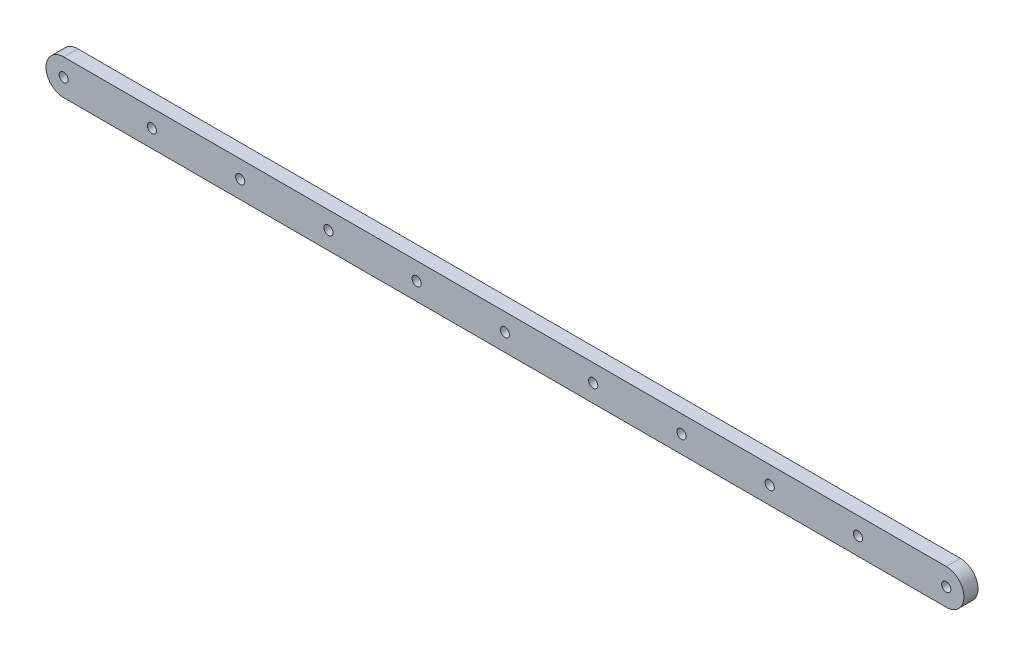
ISO-10303-21;
HEADER;
FILE_DESCRIPTION(('STEP AP214'),'2;1');
FILE_NAME('part.step','',(''),(''),'','','');
FILE_SCHEMA(('AUTOMOTIVE_DESIGN { 1 0 10303 214 1 1 1 1 }'));
ENDSEC;
DATA;
#1=APPLICATION_CONTEXT('core data for automotive mechanical design processes');
#2=APPLICATION_PROTOCOL_DEFINITION('international standard','automotive_design',2000,#1);
#3=PRODUCT_CONTEXT('',#1,'mechanical');
#4=PRODUCT('Part','Part','',(#3));
#5=PRODUCT_RELATED_PRODUCT_CATEGORY('part','',(#4));
#6=PRODUCT_DEFINITION_FORMATION('','',#4);
#7=PRODUCT_DEFINITION_CONTEXT('part definition',#1,'design');
#8=PRODUCT_DEFINITION('design','',#6,#7);
#9=PRODUCT_DEFINITION_SHAPE('','',#8);
#10=(LENGTH_UNIT() NAMED_UNIT(*) SI_UNIT(.MILLI.,.METRE.));
#11=(NAMED_UNIT(*) PLANE_ANGLE_UNIT() SI_UNIT($,.RADIAN.));
#12=(NAMED_UNIT(*) SI_UNIT($,.STERADIAN.) SOLID_ANGLE_UNIT());
#13=UNCERTAINTY_MEASURE_WITH_UNIT(LENGTH_MEASURE(1.E-05),#10,'distance_accuracy_value','');
#14=(GEOMETRIC_REPRESENTATION_CONTEXT(3) GLOBAL_UNCERTAINTY_ASSIGNED_CONTEXT((#13)) GLOBAL_UNIT_ASSIGNED_CONTEXT((#10,
#11,#12)) REPRESENTATION_CONTEXT('',''));
#15=CARTESIAN_POINT('',(0.,0.,0.));
#16=DIRECTION('',(0.,0.,1.));
#17=DIRECTION('',(1.,0.,0.));
#18=AXIS2_PLACEMENT_3D('',#15,#16,#17);
#19=CARTESIAN_POINT('',(0.,-5.,4.));
#20=DIRECTION('',(0.,-1.,0.));
#21=DIRECTION('',(1.,0.,0.));
#22=AXIS2_PLACEMENT_3D('',#19,#20,#21);
#23=PLANE('',#22);
#24=DIRECTION('',(-1.,0.,0.));
#25=VECTOR('',#24,1.);
#26=CARTESIAN_POINT('',(0.,-5.,0.));
#27=LINE('',#26,#25);
#28=CARTESIAN_POINT('',(250.,-5.,0.));
#29=VERTEX_POINT('',#28);
#30=CARTESIAN_POINT('',(0.,-5.,0.));
#31=VERTEX_POINT('',#30);
#32=EDGE_CURVE('E111',#29,#31,#27,.T.);
#33=ORIENTED_EDGE('',*,*,#32,.F.);
#34=DIRECTION('',(0.,0.,-1.));
#35=VECTOR('',#34,1.);
#36=CARTESIAN_POINT('',(250.,-5.,4.));
#37=LINE('',#36,#35);
#38=CARTESIAN_POINT('',(250.,-5.,4.));
#39=VERTEX_POINT('',#38);
#40=EDGE_CURVE('E11',#39,#29,#37,.T.);
#41=ORIENTED_EDGE('',*,*,#40,.F.);
#42=DIRECTION('',(-1.,0.,0.));
#43=VECTOR('',#42,1.);
#44=CARTESIAN_POINT('',(0.,-5.,4.));
#45=LINE('',#44,#43);
#46=CARTESIAN_POINT('',(0.,-5.,4.));
#47=VERTEX_POINT('',#46);
#48=EDGE_CURVE('E92',#39,#47,#45,.T.);
#49=ORIENTED_EDGE('',*,*,#48,.T.);
#50=DIRECTION('',(0.,0.,-1.));
#51=VECTOR('',#50,1.);
#52=CARTESIAN_POINT('',(0.,-5.,4.));
#53=LINE('',#52,#51);
#54=EDGE_CURVE('E82',#47,#31,#53,.T.);
#55=ORIENTED_EDGE('',*,*,#54,.T.);
#56=EDGE_LOOP('',(#33,#41,#49,#55));
#57=FACE_BOUND('',#56,.T.);
#58=ADVANCED_FACE('F43',(#57),#23,.T.);
#59=CARTESIAN_POINT('',(250.,0.,4.));
#60=DIRECTION('',(0.,0.,-1.));
#61=DIRECTION('',(-1.,0.,0.));
#62=AXIS2_PLACEMENT_3D('',#59,#60,#61);
#63=CYLINDRICAL_SURFACE('',#62,4.99999999999999);
#64=CARTESIAN_POINT('',(250.,0.,0.));
#65=DIRECTION('',(0.,0.,1.));
#66=DIRECTION('',(1.,0.,0.));
#67=AXIS2_PLACEMENT_3D('',#64,#65,#66);
#68=CIRCLE('',#67,4.99999999999999);
#69=CARTESIAN_POINT('',(250.,5.,0.));
#70=VERTEX_POINT('',#69);
#71=EDGE_CURVE('E99',#29,#70,#68,.T.);
#72=ORIENTED_EDGE('',*,*,#71,.T.);
#73=DIRECTION('',(0.,0.,-1.));
#74=VECTOR('',#73,1.);
#75=CARTESIAN_POINT('',(250.,5.,4.));
#76=LINE('',#75,#74);
#77=CARTESIAN_POINT('',(250.,5.,4.));
#78=VERTEX_POINT('',#77);
#79=EDGE_CURVE('E52',#78,#70,#76,.T.);
#80=ORIENTED_EDGE('',*,*,#79,.F.);
#81=CARTESIAN_POINT('',(250.,0.,4.));
#82=DIRECTION('',(0.,0.,1.));
#83=DIRECTION('',(1.,0.,0.));
#84=AXIS2_PLACEMENT_3D('',#81,#82,#83);
#85=CIRCLE('',#84,4.99999999999999);
#86=EDGE_CURVE('E87',#39,#78,#85,.T.);
#87=ORIENTED_EDGE('',*,*,#86,.F.);
#88=ORIENTED_EDGE('',*,*,#40,.T.);
#89=EDGE_LOOP('',(#72,#80,#87,#88));
#90=FACE_BOUND('',#89,.T.);
#91=ADVANCED_FACE('F97',(#90),#63,.T.);
#92=CARTESIAN_POINT('',(0.,5.,4.));
#93=DIRECTION('',(0.,1.,0.));
#94=DIRECTION('',(-1.,0.,0.));
#95=AXIS2_PLACEMENT_3D('',#92,#93,#94);
#96=PLANE('',#95);
#97=DIRECTION('',(1.,0.,0.));
#98=VECTOR('',#97,1.);
#99=CARTESIAN_POINT('',(0.,5.,0.));
#100=LINE('',#99,#98);
#101=CARTESIAN_POINT('',(0.,5.,0.));
#102=VERTEX_POINT('',#101);
#103=EDGE_CURVE('E118',#102,#70,#100,.T.);
#104=ORIENTED_EDGE('',*,*,#103,.F.);
#105=DIRECTION('',(0.,0.,-1.));
#106=VECTOR('',#105,1.);
#107=CARTESIAN_POINT('',(0.,5.,4.));
#108=LINE('',#107,#106);
#109=CARTESIAN_POINT('',(0.,5.,4.));
#110=VERTEX_POINT('',#109);
#111=EDGE_CURVE('E75',#110,#102,#108,.T.);
#112=ORIENTED_EDGE('',*,*,#111,.F.);
#113=DIRECTION('',(1.,0.,0.));
#114=VECTOR('',#113,1.);
#115=CARTESIAN_POINT('',(0.,5.,4.));
#116=LINE('',#115,#114);
#117=EDGE_CURVE('E91',#110,#78,#116,.T.);
#118=ORIENTED_EDGE('',*,*,#117,.T.);
#119=ORIENTED_EDGE('',*,*,#79,.T.);
#120=EDGE_LOOP('',(#104,#112,#118,#119));
#121=FACE_BOUND('',#120,.T.);
#122=ADVANCED_FACE('F104',(#121),#96,.T.);
#123=CARTESIAN_POINT('',(0.,0.,4.));
#124=DIRECTION('',(0.,0.,-1.));
#125=DIRECTION('',(-1.,0.,0.));
#126=AXIS2_PLACEMENT_3D('',#123,#124,#125);
#127=CYLINDRICAL_SURFACE('',#126,5.);
#128=CARTESIAN_POINT('',(0.,0.,0.));
#129=DIRECTION('',(0.,0.,1.));
#130=DIRECTION('',(1.,0.,0.));
#131=AXIS2_PLACEMENT_3D('',#128,#129,#130);
#132=CIRCLE('',#131,5.);
#133=EDGE_CURVE('E121',#102,#31,#132,.T.);
#134=ORIENTED_EDGE('',*,*,#133,.T.);
#135=ORIENTED_EDGE('',*,*,#54,.F.);
#136=CARTESIAN_POINT('',(0.,0.,4.));
#137=DIRECTION('',(0.,0.,1.));
#138=DIRECTION('',(1.,0.,0.));
#139=AXIS2_PLACEMENT_3D('',#136,#137,#138);
#140=CIRCLE('',#139,5.);
#141=EDGE_CURVE('E60',#110,#47,#140,.T.);
#142=ORIENTED_EDGE('',*,*,#141,.F.);
#143=ORIENTED_EDGE('',*,*,#111,.T.);
#144=EDGE_LOOP('',(#134,#135,#142,#143));
#145=FACE_BOUND('',#144,.T.);
#146=ADVANCED_FACE('F229',(#145),#127,.T.);
#147=CARTESIAN_POINT('',(0.,0.,4.));
#148=DIRECTION('',(0.,0.,1.));
#149=DIRECTION('',(1.,0.,0.));
#150=AXIS2_PLACEMENT_3D('',#147,#148,#149);
#151=PLANE('',#150);
#152=CARTESIAN_POINT('',(25.,0.,4.));
#153=DIRECTION('',(0.,0.,1.));
#154=DIRECTION('',(1.,0.,0.));
#155=AXIS2_PLACEMENT_3D('',#152,#153,#154);
#156=CIRCLE('',#155,1.3);
#157=CARTESIAN_POINT('',(26.3,0.,4.));
#158=VERTEX_POINT('',#157);
#159=EDGE_CURVE('E154',#158,#158,#156,.T.);
#160=ORIENTED_EDGE('',*,*,#159,.F.);
#161=EDGE_LOOP('',(#160));
#162=FACE_BOUND('',#161,.T.);
#163=CARTESIAN_POINT('',(175.,0.,4.));
#164=DIRECTION('',(0.,0.,1.));
#165=DIRECTION('',(1.,0.,0.));
#166=AXIS2_PLACEMENT_3D('',#163,#164,#165);
#167=CIRCLE('',#166,1.3);
#168=CARTESIAN_POINT('',(176.3,0.,4.));
#169=VERTEX_POINT('',#168);
#170=EDGE_CURVE('E187',#169,#169,#167,.T.);
#171=ORIENTED_EDGE('',*,*,#170,.F.);
#172=EDGE_LOOP('',(#171));
#173=FACE_BOUND('',#172,.T.);
#174=CARTESIAN_POINT('',(150.,0.,4.));
#175=DIRECTION('',(0.,0.,1.));
#176=DIRECTION('',(1.,0.,0.));
#177=AXIS2_PLACEMENT_3D('',#174,#175,#176);
#178=CIRCLE('',#177,1.3);
#179=CARTESIAN_POINT('',(151.3,0.,4.));
#180=VERTEX_POINT('',#179);
#181=EDGE_CURVE('E179',#180,#180,#178,.T.);
#182=ORIENTED_EDGE('',*,*,#181,.F.);
#183=EDGE_LOOP('',(#182));
#184=FACE_BOUND('',#183,.T.);
#185=CARTESIAN_POINT('',(225.,0.,4.));
#186=DIRECTION('',(0.,0.,1.));
#187=DIRECTION('',(1.,0.,0.));
#188=AXIS2_PLACEMENT_3D('',#185,#186,#187);
#189=CIRCLE('',#188,1.3);
#190=CARTESIAN_POINT('',(226.3,0.,4.));
#191=VERTEX_POINT('',#190);
#192=EDGE_CURVE('E203',#191,#191,#189,.T.);
#193=ORIENTED_EDGE('',*,*,#192,.F.);
#194=EDGE_LOOP('',(#193));
#195=FACE_BOUND('',#194,.T.);
#196=CARTESIAN_POINT('',(200.,0.,4.));
#197=DIRECTION('',(0.,0.,1.));
#198=DIRECTION('',(1.,0.,0.));
#199=AXIS2_PLACEMENT_3D('',#196,#197,#198);
#200=CIRCLE('',#199,1.3);
#201=CARTESIAN_POINT('',(201.3,0.,4.));
#202=VERTEX_POINT('',#201);
#203=EDGE_CURVE('E195',#202,#202,#200,.T.);
#204=ORIENTED_EDGE('',*,*,#203,.F.);
#205=EDGE_LOOP('',(#204));
#206=FACE_BOUND('',#205,.T.);
#207=CARTESIAN_POINT('',(75.,0.,4.));
#208=DIRECTION('',(0.,0.,1.));
#209=DIRECTION('',(1.,0.,0.));
#210=AXIS2_PLACEMENT_3D('',#207,#208,#209);
#211=CIRCLE('',#210,1.3);
#212=CARTESIAN_POINT('',(76.3,0.,4.));
#213=VERTEX_POINT('',#212);
#214=EDGE_CURVE('E155',#213,#213,#211,.T.);
#215=ORIENTED_EDGE('',*,*,#214,.F.);
#216=EDGE_LOOP('',(#215));
#217=FACE_BOUND('',#216,.T.);
#218=CARTESIAN_POINT('',(50.,0.,4.));
#219=DIRECTION('',(0.,0.,1.));
#220=DIRECTION('',(1.,0.,0.));
#221=AXIS2_PLACEMENT_3D('',#218,#219,#220);
#222=CIRCLE('',#221,1.3);
#223=CARTESIAN_POINT('',(51.3,0.,4.));
#224=VERTEX_POINT('',#223);
#225=EDGE_CURVE('E145',#224,#224,#222,.T.);
#226=ORIENTED_EDGE('',*,*,#225,.F.);
#227=EDGE_LOOP('',(#226));
#228=FACE_BOUND('',#227,.T.);
#229=CARTESIAN_POINT('',(125.,0.,4.));
#230=DIRECTION('',(0.,0.,1.));
#231=DIRECTION('',(1.,0.,0.));
#232=AXIS2_PLACEMENT_3D('',#229,#230,#231);
#233=CIRCLE('',#232,1.3);
#234=CARTESIAN_POINT('',(126.3,0.,4.));
#235=VERTEX_POINT('',#234);
#236=EDGE_CURVE('E171',#235,#235,#233,.T.);
#237=ORIENTED_EDGE('',*,*,#236,.F.);
#238=EDGE_LOOP('',(#237));
#239=FACE_BOUND('',#238,.T.);
#240=CARTESIAN_POINT('',(100.,0.,4.));
#241=DIRECTION('',(0.,0.,1.));
#242=DIRECTION('',(1.,0.,0.));
#243=AXIS2_PLACEMENT_3D('',#240,#241,#242);
#244=CIRCLE('',#243,1.3);
#245=CARTESIAN_POINT('',(101.3,0.,4.));
#246=VERTEX_POINT('',#245);
#247=EDGE_CURVE('E163',#246,#246,#244,.T.);
#248=ORIENTED_EDGE('',*,*,#247,.F.);
#249=EDGE_LOOP('',(#248));
#250=FACE_BOUND('',#249,.T.);
#251=CARTESIAN_POINT('',(0.,0.,4.));
#252=DIRECTION('',(0.,0.,1.));
#253=DIRECTION('',(1.,0.,0.));
#254=AXIS2_PLACEMENT_3D('',#251,#252,#253);
#255=CIRCLE('',#254,1.3);
#256=CARTESIAN_POINT('',(1.3,0.,4.));
#257=VERTEX_POINT('',#256);
#258=EDGE_CURVE('E138',#257,#257,#255,.T.);
#259=ORIENTED_EDGE('',*,*,#258,.F.);
#260=EDGE_LOOP('',(#259));
#261=FACE_BOUND('',#260,.T.);
#262=CARTESIAN_POINT('',(250.,0.,4.));
#263=DIRECTION('',(0.,0.,1.));
#264=DIRECTION('',(1.,0.,0.));
#265=AXIS2_PLACEMENT_3D('',#262,#263,#264);
#266=CIRCLE('',#265,1.30000000000004);
#267=CARTESIAN_POINT('',(251.3,0.,4.));
#268=VERTEX_POINT('',#267);
#269=EDGE_CURVE('E129',#268,#268,#266,.T.);
#270=ORIENTED_EDGE('',*,*,#269,.F.);
#271=EDGE_LOOP('',(#270));
#272=FACE_BOUND('',#271,.T.);
#273=ORIENTED_EDGE('',*,*,#48,.F.);
#274=ORIENTED_EDGE('',*,*,#86,.T.);
#275=ORIENTED_EDGE('',*,*,#117,.F.);
#276=ORIENTED_EDGE('',*,*,#141,.T.);
#277=EDGE_LOOP('',(#273,#274,#275,#276));
#278=FACE_BOUND('',#277,.T.);
#279=ADVANCED_FACE('F89',(#162,#173,#184,#195,#206,#217,#228,#239,#250,#261,#272,#278),#151,.T.);
#280=CARTESIAN_POINT('',(0.,0.,0.));
#281=DIRECTION('',(0.,0.,1.));
#282=DIRECTION('',(1.,0.,0.));
#283=AXIS2_PLACEMENT_3D('',#280,#281,#282);
#284=PLANE('',#283);
#285=CARTESIAN_POINT('',(25.,0.,0.));
#286=DIRECTION('',(0.,0.,1.));
#287=DIRECTION('',(1.,0.,0.));
#288=AXIS2_PLACEMENT_3D('',#285,#286,#287);
#289=CIRCLE('',#288,1.3);
#290=CARTESIAN_POINT('',(26.3,0.,0.));
#291=VERTEX_POINT('',#290);
#292=EDGE_CURVE('E134',#291,#291,#289,.T.);
#293=ORIENTED_EDGE('',*,*,#292,.T.);
#294=EDGE_LOOP('',(#293));
#295=FACE_BOUND('',#294,.T.);
#296=CARTESIAN_POINT('',(175.,0.,0.));
#297=DIRECTION('',(0.,0.,1.));
#298=DIRECTION('',(1.,0.,0.));
#299=AXIS2_PLACEMENT_3D('',#296,#297,#298);
#300=CIRCLE('',#299,1.3);
#301=CARTESIAN_POINT('',(176.3,0.,0.));
#302=VERTEX_POINT('',#301);
#303=EDGE_CURVE('E183',#302,#302,#300,.T.);
#304=ORIENTED_EDGE('',*,*,#303,.T.);
#305=EDGE_LOOP('',(#304));
#306=FACE_BOUND('',#305,.T.);
#307=CARTESIAN_POINT('',(150.,0.,0.));
#308=DIRECTION('',(0.,0.,1.));
#309=DIRECTION('',(1.,0.,0.));
#310=AXIS2_PLACEMENT_3D('',#307,#308,#309);
#311=CIRCLE('',#310,1.3);
#312=CARTESIAN_POINT('',(151.3,0.,0.));
#313=VERTEX_POINT('',#312);
#314=EDGE_CURVE('E175',#313,#313,#311,.T.);
#315=ORIENTED_EDGE('',*,*,#314,.T.);
#316=EDGE_LOOP('',(#315));
#317=FACE_BOUND('',#316,.T.);
#318=CARTESIAN_POINT('',(225.,0.,0.));
#319=DIRECTION('',(0.,0.,1.));
#320=DIRECTION('',(1.,0.,0.));
#321=AXIS2_PLACEMENT_3D('',#318,#319,#320);
#322=CIRCLE('',#321,1.3);
#323=CARTESIAN_POINT('',(226.3,0.,0.));
#324=VERTEX_POINT('',#323);
#325=EDGE_CURVE('E199',#324,#324,#322,.T.);
#326=ORIENTED_EDGE('',*,*,#325,.T.);
#327=EDGE_LOOP('',(#326));
#328=FACE_BOUND('',#327,.T.);
#329=CARTESIAN_POINT('',(200.,0.,0.));
#330=DIRECTION('',(0.,0.,1.));
#331=DIRECTION('',(1.,0.,0.));
#332=AXIS2_PLACEMENT_3D('',#329,#330,#331);
#333=CIRCLE('',#332,1.3);
#334=CARTESIAN_POINT('',(201.3,0.,0.));
#335=VERTEX_POINT('',#334);
#336=EDGE_CURVE('E191',#335,#335,#333,.T.);
#337=ORIENTED_EDGE('',*,*,#336,.T.);
#338=EDGE_LOOP('',(#337));
#339=FACE_BOUND('',#338,.T.);
#340=CARTESIAN_POINT('',(75.,0.,0.));
#341=DIRECTION('',(0.,0.,1.));
#342=DIRECTION('',(1.,0.,0.));
#343=AXIS2_PLACEMENT_3D('',#340,#341,#342);
#344=CIRCLE('',#343,1.3);
#345=CARTESIAN_POINT('',(76.3,0.,0.));
#346=VERTEX_POINT('',#345);
#347=EDGE_CURVE('E150',#346,#346,#344,.T.);
#348=ORIENTED_EDGE('',*,*,#347,.T.);
#349=EDGE_LOOP('',(#348));
#350=FACE_BOUND('',#349,.T.);
#351=CARTESIAN_POINT('',(50.,0.,0.));
#352=DIRECTION('',(0.,0.,1.));
#353=DIRECTION('',(1.,0.,0.));
#354=AXIS2_PLACEMENT_3D('',#351,#352,#353);
#355=CIRCLE('',#354,1.3);
#356=CARTESIAN_POINT('',(51.3,0.,0.));
#357=VERTEX_POINT('',#356);
#358=EDGE_CURVE('E149',#357,#357,#355,.T.);
#359=ORIENTED_EDGE('',*,*,#358,.T.);
#360=EDGE_LOOP('',(#359));
#361=FACE_BOUND('',#360,.T.);
#362=CARTESIAN_POINT('',(125.,0.,0.));
#363=DIRECTION('',(0.,0.,1.));
#364=DIRECTION('',(1.,0.,0.));
#365=AXIS2_PLACEMENT_3D('',#362,#363,#364);
#366=CIRCLE('',#365,1.3);
#367=CARTESIAN_POINT('',(126.3,0.,0.));
#368=VERTEX_POINT('',#367);
#369=EDGE_CURVE('E167',#368,#368,#366,.T.);
#370=ORIENTED_EDGE('',*,*,#369,.T.);
#371=EDGE_LOOP('',(#370));
#372=FACE_BOUND('',#371,.T.);
#373=CARTESIAN_POINT('',(100.,0.,0.));
#374=DIRECTION('',(0.,0.,1.));
#375=DIRECTION('',(1.,0.,0.));
#376=AXIS2_PLACEMENT_3D('',#373,#374,#375);
#377=CIRCLE('',#376,1.3);
#378=CARTESIAN_POINT('',(101.3,0.,0.));
#379=VERTEX_POINT('',#378);
#380=EDGE_CURVE('E159',#379,#379,#377,.T.);
#381=ORIENTED_EDGE('',*,*,#380,.T.);
#382=EDGE_LOOP('',(#381));
#383=FACE_BOUND('',#382,.T.);
#384=CARTESIAN_POINT('',(0.,0.,0.));
#385=DIRECTION('',(0.,0.,1.));
#386=DIRECTION('',(1.,0.,0.));
#387=AXIS2_PLACEMENT_3D('',#384,#385,#386);
#388=CIRCLE('',#387,1.3);
#389=CARTESIAN_POINT('',(1.3,0.,0.));
#390=VERTEX_POINT('',#389);
#391=EDGE_CURVE('E115',#390,#390,#388,.T.);
#392=ORIENTED_EDGE('',*,*,#391,.T.);
#393=EDGE_LOOP('',(#392));
#394=FACE_BOUND('',#393,.T.);
#395=CARTESIAN_POINT('',(250.,0.,0.));
#396=DIRECTION('',(0.,0.,1.));
#397=DIRECTION('',(1.,0.,0.));
#398=AXIS2_PLACEMENT_3D('',#395,#396,#397);
#399=CIRCLE('',#398,1.30000000000004);
#400=CARTESIAN_POINT('',(251.3,0.,0.));
#401=VERTEX_POINT('',#400);
#402=EDGE_CURVE('E133',#401,#401,#399,.T.);
#403=ORIENTED_EDGE('',*,*,#402,.T.);
#404=EDGE_LOOP('',(#403));
#405=FACE_BOUND('',#404,.T.);
#406=ORIENTED_EDGE('',*,*,#32,.T.);
#407=ORIENTED_EDGE('',*,*,#133,.F.);
#408=ORIENTED_EDGE('',*,*,#103,.T.);
#409=ORIENTED_EDGE('',*,*,#71,.F.);
#410=EDGE_LOOP('',(#406,#407,#408,#409));
#411=FACE_BOUND('',#410,.T.);
#412=ADVANCED_FACE('F217',(#295,#306,#317,#328,#339,#350,#361,#372,#383,#394,#405,#411),#284,.F.);
#413=CARTESIAN_POINT('',(250.,0.,0.));
#414=DIRECTION('',(0.,0.,1.));
#415=DIRECTION('',(1.,0.,0.));
#416=AXIS2_PLACEMENT_3D('',#413,#414,#415);
#417=CYLINDRICAL_SURFACE('',#416,1.30000000000004);
#418=ORIENTED_EDGE('',*,*,#402,.F.);
#419=EDGE_LOOP('',(#418));
#420=FACE_BOUND('',#419,.T.);
#421=ORIENTED_EDGE('',*,*,#269,.T.);
#422=EDGE_LOOP('',(#421));
#423=FACE_BOUND('',#422,.T.);
#424=ADVANCED_FACE('F251',(#420,#423),#417,.F.);
#425=CARTESIAN_POINT('',(0.,0.,0.));
#426=DIRECTION('',(0.,0.,1.));
#427=DIRECTION('',(1.,0.,0.));
#428=AXIS2_PLACEMENT_3D('',#425,#426,#427);
#429=CYLINDRICAL_SURFACE('',#428,1.3);
#430=ORIENTED_EDGE('',*,*,#391,.F.);
#431=EDGE_LOOP('',(#430));
#432=FACE_BOUND('',#431,.T.);
#433=ORIENTED_EDGE('',*,*,#258,.T.);
#434=EDGE_LOOP('',(#433));
#435=FACE_BOUND('',#434,.T.);
#436=ADVANCED_FACE('F253',(#432,#435),#429,.F.);
#437=CARTESIAN_POINT('',(100.,0.,0.));
#438=DIRECTION('',(0.,0.,1.));
#439=DIRECTION('',(1.,0.,0.));
#440=AXIS2_PLACEMENT_3D('',#437,#438,#439);
#441=CYLINDRICAL_SURFACE('',#440,1.3);
#442=ORIENTED_EDGE('',*,*,#380,.F.);
#443=EDGE_LOOP('',(#442));
#444=FACE_BOUND('',#443,.T.);
#445=ORIENTED_EDGE('',*,*,#247,.T.);
#446=EDGE_LOOP('',(#445));
#447=FACE_BOUND('',#446,.T.);
#448=ADVANCED_FACE('F260',(#444,#447),#441,.F.);
#449=CARTESIAN_POINT('',(125.,0.,0.));
#450=DIRECTION('',(0.,0.,1.));
#451=DIRECTION('',(1.,0.,0.));
#452=AXIS2_PLACEMENT_3D('',#449,#450,#451);
#453=CYLINDRICAL_SURFACE('',#452,1.3);
#454=ORIENTED_EDGE('',*,*,#369,.F.);
#455=EDGE_LOOP('',(#454));
#456=FACE_BOUND('',#455,.T.);
#457=ORIENTED_EDGE('',*,*,#236,.T.);
#458=EDGE_LOOP('',(#457));
#459=FACE_BOUND('',#458,.T.);
#460=ADVANCED_FACE('F300',(#456,#459),#453,.F.);
#461=CARTESIAN_POINT('',(50.,0.,0.));
#462=DIRECTION('',(0.,0.,1.));
#463=DIRECTION('',(1.,0.,0.));
#464=AXIS2_PLACEMENT_3D('',#461,#462,#463);
#465=CYLINDRICAL_SURFACE('',#464,1.3);
#466=ORIENTED_EDGE('',*,*,#358,.F.);
#467=EDGE_LOOP('',(#466));
#468=FACE_BOUND('',#467,.T.);
#469=ORIENTED_EDGE('',*,*,#225,.T.);
#470=EDGE_LOOP('',(#469));
#471=FACE_BOUND('',#470,.T.);
#472=ADVANCED_FACE('F311',(#468,#471),#465,.F.);
#473=CARTESIAN_POINT('',(75.,0.,0.));
#474=DIRECTION('',(0.,0.,1.));
#475=DIRECTION('',(1.,0.,0.));
#476=AXIS2_PLACEMENT_3D('',#473,#474,#475);
#477=CYLINDRICAL_SURFACE('',#476,1.3);
#478=ORIENTED_EDGE('',*,*,#347,.F.);
#479=EDGE_LOOP('',(#478));
#480=FACE_BOUND('',#479,.T.);
#481=ORIENTED_EDGE('',*,*,#214,.T.);
#482=EDGE_LOOP('',(#481));
#483=FACE_BOUND('',#482,.T.);
#484=ADVANCED_FACE('F321',(#480,#483),#477,.F.);
#485=CARTESIAN_POINT('',(200.,0.,0.));
#486=DIRECTION('',(0.,0.,1.));
#487=DIRECTION('',(1.,0.,0.));
#488=AXIS2_PLACEMENT_3D('',#485,#486,#487);
#489=CYLINDRICAL_SURFACE('',#488,1.3);
#490=ORIENTED_EDGE('',*,*,#336,.F.);
#491=EDGE_LOOP('',(#490));
#492=FACE_BOUND('',#491,.T.);
#493=ORIENTED_EDGE('',*,*,#203,.T.);
#494=EDGE_LOOP('',(#493));
#495=FACE_BOUND('',#494,.T.);
#496=ADVANCED_FACE('F331',(#492,#495),#489,.F.);
#497=CARTESIAN_POINT('',(225.,0.,0.));
#498=DIRECTION('',(0.,0.,1.));
#499=DIRECTION('',(1.,0.,0.));
#500=AXIS2_PLACEMENT_3D('',#497,#498,#499);
#501=CYLINDRICAL_SURFACE('',#500,1.3);
#502=ORIENTED_EDGE('',*,*,#325,.F.);
#503=EDGE_LOOP('',(#502));
#504=FACE_BOUND('',#503,.T.);
#505=ORIENTED_EDGE('',*,*,#192,.T.);
#506=EDGE_LOOP('',(#505));
#507=FACE_BOUND('',#506,.T.);
#508=ADVANCED_FACE('F341',(#504,#507),#501,.F.);
#509=CARTESIAN_POINT('',(150.,0.,0.));
#510=DIRECTION('',(0.,0.,1.));
#511=DIRECTION('',(1.,0.,0.));
#512=AXIS2_PLACEMENT_3D('',#509,#510,#511);
#513=CYLINDRICAL_SURFACE('',#512,1.3);
#514=ORIENTED_EDGE('',*,*,#314,.F.);
#515=EDGE_LOOP('',(#514));
#516=FACE_BOUND('',#515,.T.);
#517=ORIENTED_EDGE('',*,*,#181,.T.);
#518=EDGE_LOOP('',(#517));
#519=FACE_BOUND('',#518,.T.);
#520=ADVANCED_FACE('F351',(#516,#519),#513,.F.);
#521=CARTESIAN_POINT('',(175.,0.,0.));
#522=DIRECTION('',(0.,0.,1.));
#523=DIRECTION('',(1.,0.,0.));
#524=AXIS2_PLACEMENT_3D('',#521,#522,#523);
#525=CYLINDRICAL_SURFACE('',#524,1.3);
#526=ORIENTED_EDGE('',*,*,#303,.F.);
#527=EDGE_LOOP('',(#526));
#528=FACE_BOUND('',#527,.T.);
#529=ORIENTED_EDGE('',*,*,#170,.T.);
#530=EDGE_LOOP('',(#529));
#531=FACE_BOUND('',#530,.T.);
#532=ADVANCED_FACE('F223',(#528,#531),#525,.F.);
#533=CARTESIAN_POINT('',(25.,0.,0.));
#534=DIRECTION('',(0.,0.,1.));
#535=DIRECTION('',(1.,0.,0.));
#536=AXIS2_PLACEMENT_3D('',#533,#534,#535);
#537=CYLINDRICAL_SURFACE('',#536,1.3);
#538=ORIENTED_EDGE('',*,*,#292,.F.);
#539=EDGE_LOOP('',(#538));
#540=FACE_BOUND('',#539,.T.);
#541=ORIENTED_EDGE('',*,*,#159,.T.);
#542=EDGE_LOOP('',(#541));
#543=FACE_BOUND('',#542,.T.);
#544=ADVANCED_FACE('F220',(#540,#543),#537,.F.);
#545=CLOSED_SHELL('',(#58,#91,#122,#146,#279,#412,#424,#436,#448,#460,#472,#484,#496,#508,#520,
#532,#544));
#546=MANIFOLD_SOLID_BREP('B2',#545);
#547=ADVANCED_BREP_SHAPE_REPRESENTATION('',(#18,#546),#14);
#548=SHAPE_DEFINITION_REPRESENTATION(#9,#547);
ENDSEC;
END-ISO-10303-21;
